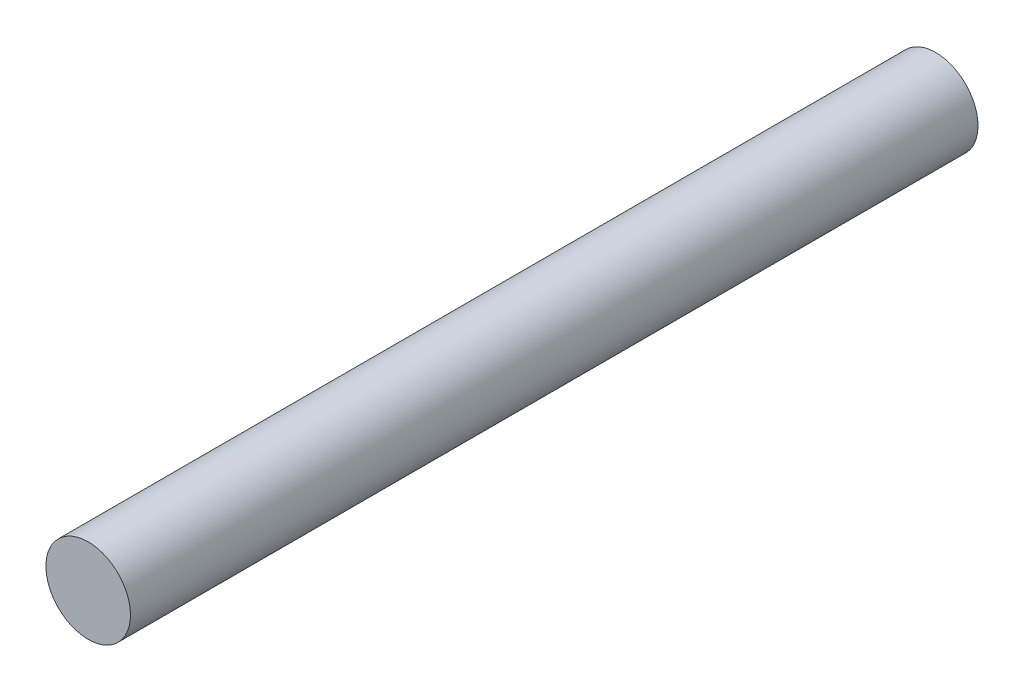
ISO-10303-21;
HEADER;
FILE_DESCRIPTION(('STEP AP214'),'2;1');
FILE_NAME('part.step','',(''),(''),'','','');
FILE_SCHEMA(('AUTOMOTIVE_DESIGN { 1 0 10303 214 1 1 1 1 }'));
ENDSEC;
DATA;
#1=APPLICATION_CONTEXT('core data for automotive mechanical design processes');
#2=APPLICATION_PROTOCOL_DEFINITION('international standard','automotive_design',2000,#1);
#3=PRODUCT_CONTEXT('',#1,'mechanical');
#4=PRODUCT('Part','Part','',(#3));
#5=PRODUCT_RELATED_PRODUCT_CATEGORY('part','',(#4));
#6=PRODUCT_DEFINITION_FORMATION('','',#4);
#7=PRODUCT_DEFINITION_CONTEXT('part definition',#1,'design');
#8=PRODUCT_DEFINITION('design','',#6,#7);
#9=PRODUCT_DEFINITION_SHAPE('','',#8);
#10=(LENGTH_UNIT() NAMED_UNIT(*) SI_UNIT(.MILLI.,.METRE.));
#11=(NAMED_UNIT(*) PLANE_ANGLE_UNIT() SI_UNIT($,.RADIAN.));
#12=(NAMED_UNIT(*) SI_UNIT($,.STERADIAN.) SOLID_ANGLE_UNIT());
#13=UNCERTAINTY_MEASURE_WITH_UNIT(LENGTH_MEASURE(1.E-05),#10,'distance_accuracy_value','');
#14=(GEOMETRIC_REPRESENTATION_CONTEXT(3) GLOBAL_UNCERTAINTY_ASSIGNED_CONTEXT((#13)) GLOBAL_UNIT_ASSIGNED_CONTEXT((#10,
#11,#12)) REPRESENTATION_CONTEXT('',''));
#15=CARTESIAN_POINT('',(0.,0.,0.));
#16=DIRECTION('',(0.,0.,1.));
#17=DIRECTION('',(1.,0.,0.));
#18=AXIS2_PLACEMENT_3D('',#15,#16,#17);
#19=CARTESIAN_POINT('',(0.,0.,-81.7));
#20=DIRECTION('',(0.,0.,1.));
#21=DIRECTION('',(1.,0.,0.));
#22=AXIS2_PLACEMENT_3D('',#19,#20,#21);
#23=CYLINDRICAL_SURFACE('',#22,4.075);
#24=CARTESIAN_POINT('',(0.,0.,-81.7));
#25=DIRECTION('',(0.,0.,1.));
#26=DIRECTION('',(1.,0.,0.));
#27=AXIS2_PLACEMENT_3D('',#24,#25,#26);
#28=CIRCLE('',#27,4.075);
#29=CARTESIAN_POINT('',(4.075,0.,-81.7));
#30=VERTEX_POINT('',#29);
#31=EDGE_CURVE('E10',#30,#30,#28,.T.);
#32=ORIENTED_EDGE('',*,*,#31,.T.);
#33=EDGE_LOOP('',(#32));
#34=FACE_BOUND('',#33,.T.);
#35=CARTESIAN_POINT('',(0.,0.,0.));
#36=DIRECTION('',(0.,0.,1.));
#37=DIRECTION('',(1.,0.,0.));
#38=AXIS2_PLACEMENT_3D('',#35,#36,#37);
#39=CIRCLE('',#38,4.075);
#40=CARTESIAN_POINT('',(4.075,0.,0.));
#41=VERTEX_POINT('',#40);
#42=EDGE_CURVE('E38',#41,#41,#39,.T.);
#43=ORIENTED_EDGE('',*,*,#42,.F.);
#44=EDGE_LOOP('',(#43));
#45=FACE_BOUND('',#44,.T.);
#46=ADVANCED_FACE('F35',(#34,#45),#23,.T.);
#47=CARTESIAN_POINT('',(0.,0.,-81.7));
#48=DIRECTION('',(0.,0.,1.));
#49=DIRECTION('',(1.,0.,0.));
#50=AXIS2_PLACEMENT_3D('',#47,#48,#49);
#51=PLANE('',#50);
#52=ORIENTED_EDGE('',*,*,#31,.F.);
#53=EDGE_LOOP('',(#52));
#54=FACE_BOUND('',#53,.T.);
#55=ADVANCED_FACE('F50',(#54),#51,.F.);
#56=CARTESIAN_POINT('',(0.,0.,0.));
#57=DIRECTION('',(0.,0.,1.));
#58=DIRECTION('',(1.,0.,0.));
#59=AXIS2_PLACEMENT_3D('',#56,#57,#58);
#60=PLANE('',#59);
#61=ORIENTED_EDGE('',*,*,#42,.T.);
#62=EDGE_LOOP('',(#61));
#63=FACE_BOUND('',#62,.T.);
#64=ADVANCED_FACE('F47',(#63),#60,.T.);
#65=CLOSED_SHELL('',(#46,#55,#64));
#66=MANIFOLD_SOLID_BREP('B2',#65);
#67=ADVANCED_BREP_SHAPE_REPRESENTATION('',(#18,#66),#14);
#68=SHAPE_DEFINITION_REPRESENTATION(#9,#67);
ENDSEC;
END-ISO-10303-21;
